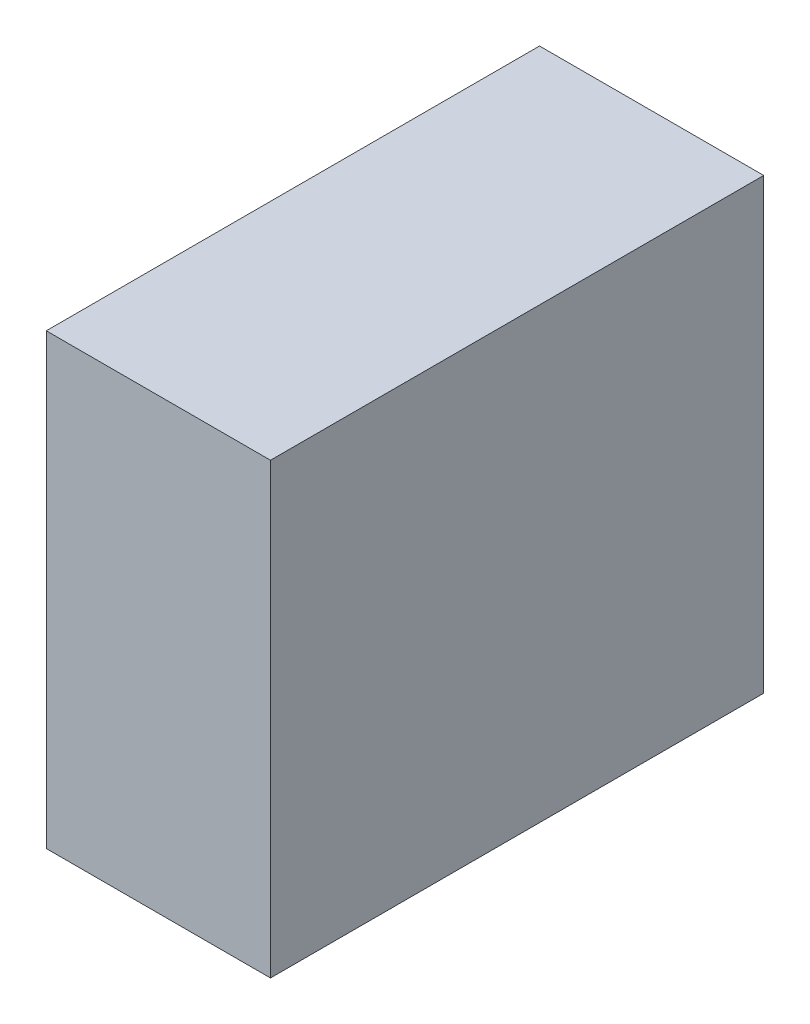
ISO-10303-21;
HEADER;
FILE_DESCRIPTION(('STEP AP214'),'2;1');
FILE_NAME('part.step','',(''),(''),'','','');
FILE_SCHEMA(('AUTOMOTIVE_DESIGN { 1 0 10303 214 1 1 1 1 }'));
ENDSEC;
DATA;
#1=APPLICATION_CONTEXT('core data for automotive mechanical design processes');
#2=APPLICATION_PROTOCOL_DEFINITION('international standard','automotive_design',2000,#1);
#3=PRODUCT_CONTEXT('',#1,'mechanical');
#4=PRODUCT('Part','Part','',(#3));
#5=PRODUCT_RELATED_PRODUCT_CATEGORY('part','',(#4));
#6=PRODUCT_DEFINITION_FORMATION('','',#4);
#7=PRODUCT_DEFINITION_CONTEXT('part definition',#1,'design');
#8=PRODUCT_DEFINITION('design','',#6,#7);
#9=PRODUCT_DEFINITION_SHAPE('','',#8);
#10=(LENGTH_UNIT() NAMED_UNIT(*) SI_UNIT(.MILLI.,.METRE.));
#11=(NAMED_UNIT(*) PLANE_ANGLE_UNIT() SI_UNIT($,.RADIAN.));
#12=(NAMED_UNIT(*) SI_UNIT($,.STERADIAN.) SOLID_ANGLE_UNIT());
#13=UNCERTAINTY_MEASURE_WITH_UNIT(LENGTH_MEASURE(1.E-05),#10,'distance_accuracy_value','');
#14=(GEOMETRIC_REPRESENTATION_CONTEXT(3) GLOBAL_UNCERTAINTY_ASSIGNED_CONTEXT((#13)) GLOBAL_UNIT_ASSIGNED_CONTEXT((#10,
#11,#12)) REPRESENTATION_CONTEXT('',''));
#15=CARTESIAN_POINT('',(0.,0.,0.));
#16=DIRECTION('',(0.,0.,1.));
#17=DIRECTION('',(1.,0.,0.));
#18=AXIS2_PLACEMENT_3D('',#15,#16,#17);
#19=CARTESIAN_POINT('',(-0.25,0.,0.));
#20=DIRECTION('',(-1.,0.,0.));
#21=DIRECTION('',(0.,0.,-1.));
#22=AXIS2_PLACEMENT_3D('',#19,#20,#21);
#23=PLANE('',#22);
#24=DIRECTION('',(0.,0.,-1.));
#25=VECTOR('',#24,1.);
#26=CARTESIAN_POINT('',(-0.25,-0.25,0.55));
#27=LINE('',#26,#25);
#28=CARTESIAN_POINT('',(-0.25,-0.25,0.55));
#29=VERTEX_POINT('',#28);
#30=CARTESIAN_POINT('',(-0.25,-0.25,0.));
#31=VERTEX_POINT('',#30);
#32=EDGE_CURVE('E11',#29,#31,#27,.T.);
#33=ORIENTED_EDGE('',*,*,#32,.T.);
#34=DIRECTION('',(0.,1.,0.));
#35=VECTOR('',#34,1.);
#36=CARTESIAN_POINT('',(-0.25,-0.25,0.));
#37=LINE('',#36,#35);
#38=CARTESIAN_POINT('',(-0.25,0.25,0.));
#39=VERTEX_POINT('',#38);
#40=EDGE_CURVE('E23',#31,#39,#37,.T.);
#41=ORIENTED_EDGE('',*,*,#40,.T.);
#42=DIRECTION('',(0.,0.,1.));
#43=VECTOR('',#42,1.);
#44=CARTESIAN_POINT('',(-0.25,0.25,0.));
#45=LINE('',#44,#43);
#46=CARTESIAN_POINT('',(-0.25,0.25,0.55));
#47=VERTEX_POINT('',#46);
#48=EDGE_CURVE('E86',#39,#47,#45,.T.);
#49=ORIENTED_EDGE('',*,*,#48,.T.);
#50=DIRECTION('',(0.,-1.,0.));
#51=VECTOR('',#50,1.);
#52=CARTESIAN_POINT('',(-0.25,0.25,0.55));
#53=LINE('',#52,#51);
#54=EDGE_CURVE('E75',#47,#29,#53,.T.);
#55=ORIENTED_EDGE('',*,*,#54,.T.);
#56=EDGE_LOOP('',(#33,#41,#49,#55));
#57=FACE_BOUND('',#56,.T.);
#58=ADVANCED_FACE('F16',(#57),#23,.F.);
#59=CARTESIAN_POINT('',(-0.5,-0.25,0.55));
#60=DIRECTION('',(1.,0.,0.));
#61=DIRECTION('',(0.,0.,-1.));
#62=AXIS2_PLACEMENT_3D('',#59,#60,#61);
#63=PLANE('',#62);
#64=DIRECTION('',(0.,-1.,0.));
#65=VECTOR('',#64,1.);
#66=CARTESIAN_POINT('',(-0.5,-0.25,0.));
#67=LINE('',#66,#65);
#68=CARTESIAN_POINT('',(-0.5,0.25,0.));
#69=VERTEX_POINT('',#68);
#70=CARTESIAN_POINT('',(-0.5,-0.25,0.));
#71=VERTEX_POINT('',#70);
#72=EDGE_CURVE('E83',#69,#71,#67,.T.);
#73=ORIENTED_EDGE('',*,*,#72,.T.);
#74=DIRECTION('',(0.,0.,-1.));
#75=VECTOR('',#74,1.);
#76=CARTESIAN_POINT('',(-0.5,-0.25,0.55));
#77=LINE('',#76,#75);
#78=CARTESIAN_POINT('',(-0.5,-0.25,0.55));
#79=VERTEX_POINT('',#78);
#80=EDGE_CURVE('E59',#79,#71,#77,.T.);
#81=ORIENTED_EDGE('',*,*,#80,.F.);
#82=DIRECTION('',(0.,-1.,0.));
#83=VECTOR('',#82,1.);
#84=CARTESIAN_POINT('',(-0.5,-0.25,0.55));
#85=LINE('',#84,#83);
#86=CARTESIAN_POINT('',(-0.5,0.25,0.55));
#87=VERTEX_POINT('',#86);
#88=EDGE_CURVE('E53',#87,#79,#85,.T.);
#89=ORIENTED_EDGE('',*,*,#88,.F.);
#90=DIRECTION('',(0.,0.,-1.));
#91=VECTOR('',#90,1.);
#92=CARTESIAN_POINT('',(-0.5,0.25,0.55));
#93=LINE('',#92,#91);
#94=EDGE_CURVE('E56',#87,#69,#93,.T.);
#95=ORIENTED_EDGE('',*,*,#94,.T.);
#96=EDGE_LOOP('',(#73,#81,#89,#95));
#97=FACE_BOUND('',#96,.T.);
#98=ADVANCED_FACE('F55',(#97),#63,.F.);
#99=CARTESIAN_POINT('',(0.5,-0.25,0.55));
#100=DIRECTION('',(0.,1.,0.));
#101=DIRECTION('',(0.,0.,1.));
#102=AXIS2_PLACEMENT_3D('',#99,#100,#101);
#103=PLANE('',#102);
#104=ORIENTED_EDGE('',*,*,#32,.F.);
#105=DIRECTION('',(1.,0.,0.));
#106=VECTOR('',#105,1.);
#107=CARTESIAN_POINT('',(0.5,-0.25,0.55));
#108=LINE('',#107,#106);
#109=EDGE_CURVE('E71',#79,#29,#108,.T.);
#110=ORIENTED_EDGE('',*,*,#109,.F.);
#111=ORIENTED_EDGE('',*,*,#80,.T.);
#112=DIRECTION('',(1.,0.,0.));
#113=VECTOR('',#112,1.);
#114=CARTESIAN_POINT('',(0.5,-0.25,0.));
#115=LINE('',#114,#113);
#116=EDGE_CURVE('E77',#71,#31,#115,.T.);
#117=ORIENTED_EDGE('',*,*,#116,.T.);
#118=EDGE_LOOP('',(#104,#110,#111,#117));
#119=FACE_BOUND('',#118,.T.);
#120=ADVANCED_FACE('F90',(#119),#103,.F.);
#121=CARTESIAN_POINT('',(-0.5,0.25,0.55));
#122=DIRECTION('',(0.,-1.,0.));
#123=DIRECTION('',(0.,0.,-1.));
#124=AXIS2_PLACEMENT_3D('',#121,#122,#123);
#125=PLANE('',#124);
#126=ORIENTED_EDGE('',*,*,#48,.F.);
#127=DIRECTION('',(-1.,0.,0.));
#128=VECTOR('',#127,1.);
#129=CARTESIAN_POINT('',(-0.5,0.25,0.));
#130=LINE('',#129,#128);
#131=EDGE_CURVE('E70',#39,#69,#130,.T.);
#132=ORIENTED_EDGE('',*,*,#131,.T.);
#133=ORIENTED_EDGE('',*,*,#94,.F.);
#134=DIRECTION('',(-1.,0.,0.));
#135=VECTOR('',#134,1.);
#136=CARTESIAN_POINT('',(-0.5,0.25,0.55));
#137=LINE('',#136,#135);
#138=EDGE_CURVE('E68',#47,#87,#137,.T.);
#139=ORIENTED_EDGE('',*,*,#138,.F.);
#140=EDGE_LOOP('',(#126,#132,#133,#139));
#141=FACE_BOUND('',#140,.T.);
#142=ADVANCED_FACE('F67',(#141),#125,.F.);
#143=CARTESIAN_POINT('',(0.,0.,0.55));
#144=DIRECTION('',(0.,0.,-1.));
#145=DIRECTION('',(-1.,0.,0.));
#146=AXIS2_PLACEMENT_3D('',#143,#144,#145);
#147=PLANE('',#146);
#148=ORIENTED_EDGE('',*,*,#54,.F.);
#149=ORIENTED_EDGE('',*,*,#138,.T.);
#150=ORIENTED_EDGE('',*,*,#88,.T.);
#151=ORIENTED_EDGE('',*,*,#109,.T.);
#152=EDGE_LOOP('',(#148,#149,#150,#151));
#153=FACE_BOUND('',#152,.T.);
#154=ADVANCED_FACE('F74',(#153),#147,.F.);
#155=CARTESIAN_POINT('',(0.,0.,0.));
#156=DIRECTION('',(0.,0.,-1.));
#157=DIRECTION('',(-1.,0.,0.));
#158=AXIS2_PLACEMENT_3D('',#155,#156,#157);
#159=PLANE('',#158);
#160=ORIENTED_EDGE('',*,*,#40,.F.);
#161=ORIENTED_EDGE('',*,*,#116,.F.);
#162=ORIENTED_EDGE('',*,*,#72,.F.);
#163=ORIENTED_EDGE('',*,*,#131,.F.);
#164=EDGE_LOOP('',(#160,#161,#162,#163));
#165=FACE_BOUND('',#164,.T.);
#166=ADVANCED_FACE('F89',(#165),#159,.T.);
#167=CLOSED_SHELL('',(#58,#98,#120,#142,#154,#166));
#168=MANIFOLD_SOLID_BREP('B1',#167);
#169=ADVANCED_BREP_SHAPE_REPRESENTATION('',(#18,#168),#14);
#170=SHAPE_DEFINITION_REPRESENTATION(#9,#169);
ENDSEC;
END-ISO-10303-21;
